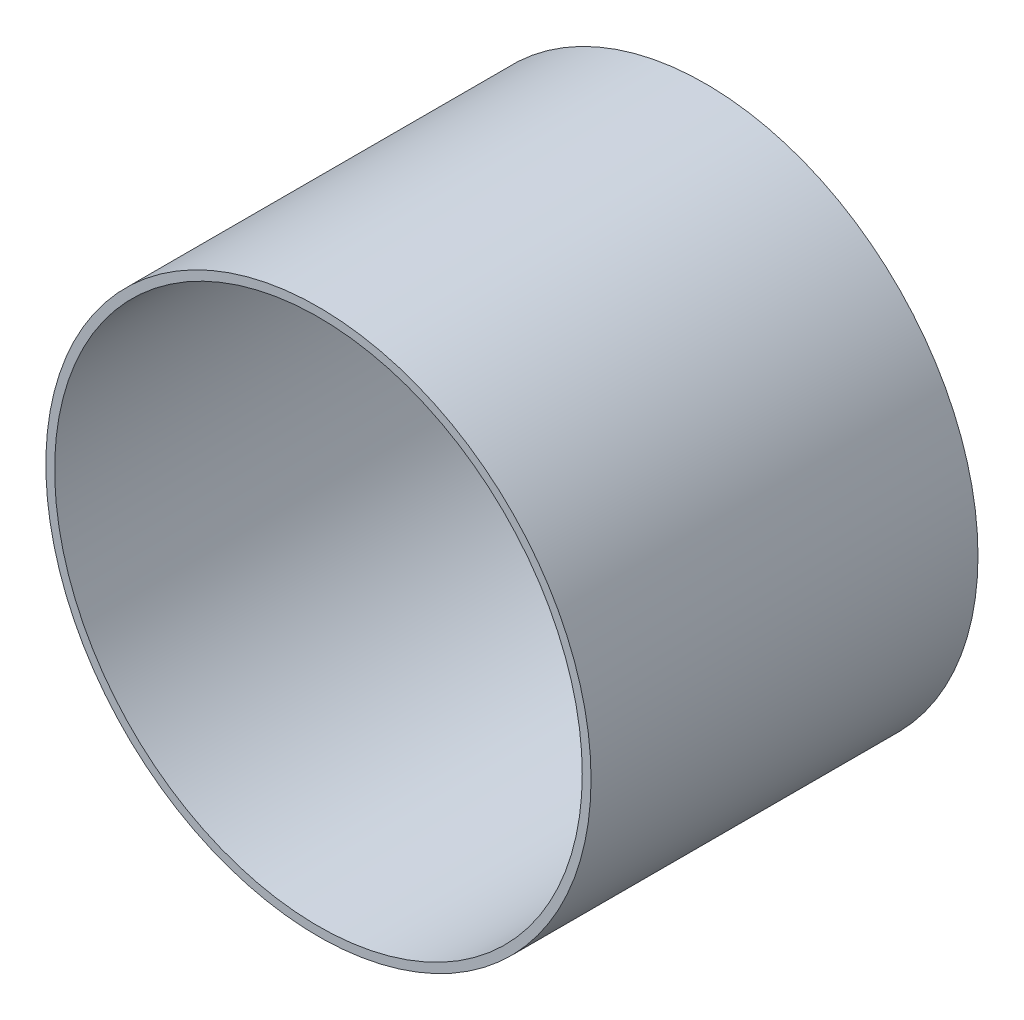
ISO-10303-21;
HEADER;
FILE_DESCRIPTION(('STEP AP214'),'2;1');
FILE_NAME('part.step','',(''),(''),'','','');
FILE_SCHEMA(('AUTOMOTIVE_DESIGN { 1 0 10303 214 1 1 1 1 }'));
ENDSEC;
DATA;
#1=APPLICATION_CONTEXT('core data for automotive mechanical design processes');
#2=APPLICATION_PROTOCOL_DEFINITION('international standard','automotive_design',2000,#1);
#3=PRODUCT_CONTEXT('',#1,'mechanical');
#4=PRODUCT('Part','Part','',(#3));
#5=PRODUCT_RELATED_PRODUCT_CATEGORY('part','',(#4));
#6=PRODUCT_DEFINITION_FORMATION('','',#4);
#7=PRODUCT_DEFINITION_CONTEXT('part definition',#1,'design');
#8=PRODUCT_DEFINITION('design','',#6,#7);
#9=PRODUCT_DEFINITION_SHAPE('','',#8);
#10=(LENGTH_UNIT() NAMED_UNIT(*) SI_UNIT(.MILLI.,.METRE.));
#11=(NAMED_UNIT(*) PLANE_ANGLE_UNIT() SI_UNIT($,.RADIAN.));
#12=(NAMED_UNIT(*) SI_UNIT($,.STERADIAN.) SOLID_ANGLE_UNIT());
#13=UNCERTAINTY_MEASURE_WITH_UNIT(LENGTH_MEASURE(1.E-05),#10,'distance_accuracy_value','');
#14=(GEOMETRIC_REPRESENTATION_CONTEXT(3) GLOBAL_UNCERTAINTY_ASSIGNED_CONTEXT((#13)) GLOBAL_UNIT_ASSIGNED_CONTEXT((#10,
#11,#12)) REPRESENTATION_CONTEXT('',''));
#15=CARTESIAN_POINT('',(0.,0.,0.));
#16=DIRECTION('',(0.,0.,1.));
#17=DIRECTION('',(1.,0.,0.));
#18=AXIS2_PLACEMENT_3D('',#15,#16,#17);
#19=CARTESIAN_POINT('',(0.,0.,22.));
#20=DIRECTION('',(0.,0.,1.));
#21=DIRECTION('',(1.,0.,0.));
#22=AXIS2_PLACEMENT_3D('',#19,#20,#21);
#23=PLANE('',#22);
#24=CARTESIAN_POINT('',(0.,0.,22.));
#25=DIRECTION('',(0.,0.,1.));
#26=DIRECTION('',(1.,0.,0.));
#27=AXIS2_PLACEMENT_3D('',#24,#25,#26);
#28=CIRCLE('',#27,15.5);
#29=CARTESIAN_POINT('',(15.5,0.,22.));
#30=VERTEX_POINT('',#29);
#31=EDGE_CURVE('E10',#30,#30,#28,.T.);
#32=ORIENTED_EDGE('',*,*,#31,.T.);
#33=EDGE_LOOP('',(#32));
#34=FACE_BOUND('',#33,.T.);
#35=CARTESIAN_POINT('',(0.,0.,22.));
#36=DIRECTION('',(0.,0.,1.));
#37=DIRECTION('',(1.,0.,0.));
#38=AXIS2_PLACEMENT_3D('',#35,#36,#37);
#39=CIRCLE('',#38,15.);
#40=CARTESIAN_POINT('',(15.,0.,22.));
#41=VERTEX_POINT('',#40);
#42=EDGE_CURVE('E50',#41,#41,#39,.T.);
#43=ORIENTED_EDGE('',*,*,#42,.F.);
#44=EDGE_LOOP('',(#43));
#45=FACE_BOUND('',#44,.T.);
#46=ADVANCED_FACE('F37',(#34,#45),#23,.T.);
#47=CARTESIAN_POINT('',(0.,0.,0.));
#48=DIRECTION('',(0.,0.,1.));
#49=DIRECTION('',(1.,0.,0.));
#50=AXIS2_PLACEMENT_3D('',#47,#48,#49);
#51=PLANE('',#50);
#52=CARTESIAN_POINT('',(0.,0.,0.));
#53=DIRECTION('',(0.,0.,1.));
#54=DIRECTION('',(1.,0.,0.));
#55=AXIS2_PLACEMENT_3D('',#52,#53,#54);
#56=CIRCLE('',#55,15.5);
#57=CARTESIAN_POINT('',(15.5,0.,0.));
#58=VERTEX_POINT('',#57);
#59=EDGE_CURVE('E41',#58,#58,#56,.T.);
#60=ORIENTED_EDGE('',*,*,#59,.F.);
#61=EDGE_LOOP('',(#60));
#62=FACE_BOUND('',#61,.T.);
#63=CARTESIAN_POINT('',(0.,0.,0.));
#64=DIRECTION('',(0.,0.,1.));
#65=DIRECTION('',(1.,0.,0.));
#66=AXIS2_PLACEMENT_3D('',#63,#64,#65);
#67=CIRCLE('',#66,15.);
#68=CARTESIAN_POINT('',(15.,0.,0.));
#69=VERTEX_POINT('',#68);
#70=EDGE_CURVE('E52',#69,#69,#67,.T.);
#71=ORIENTED_EDGE('',*,*,#70,.T.);
#72=EDGE_LOOP('',(#71));
#73=FACE_BOUND('',#72,.T.);
#74=ADVANCED_FACE('F64',(#62,#73),#51,.F.);
#75=CARTESIAN_POINT('',(0.,0.,22.));
#76=DIRECTION('',(0.,0.,-1.));
#77=DIRECTION('',(-1.,0.,0.));
#78=AXIS2_PLACEMENT_3D('',#75,#76,#77);
#79=CYLINDRICAL_SURFACE('',#78,15.5);
#80=ORIENTED_EDGE('',*,*,#31,.F.);
#81=EDGE_LOOP('',(#80));
#82=FACE_BOUND('',#81,.T.);
#83=ORIENTED_EDGE('',*,*,#59,.T.);
#84=EDGE_LOOP('',(#83));
#85=FACE_BOUND('',#84,.T.);
#86=ADVANCED_FACE('F39',(#82,#85),#79,.T.);
#87=CARTESIAN_POINT('',(0.,0.,22.));
#88=DIRECTION('',(0.,0.,-1.));
#89=DIRECTION('',(-1.,0.,0.));
#90=AXIS2_PLACEMENT_3D('',#87,#88,#89);
#91=CYLINDRICAL_SURFACE('',#90,15.);
#92=ORIENTED_EDGE('',*,*,#42,.T.);
#93=EDGE_LOOP('',(#92));
#94=FACE_BOUND('',#93,.T.);
#95=ORIENTED_EDGE('',*,*,#70,.F.);
#96=EDGE_LOOP('',(#95));
#97=FACE_BOUND('',#96,.T.);
#98=ADVANCED_FACE('F60',(#94,#97),#91,.F.);
#99=CLOSED_SHELL('',(#46,#74,#86,#98));
#100=MANIFOLD_SOLID_BREP('B2',#99);
#101=ADVANCED_BREP_SHAPE_REPRESENTATION('',(#18,#100),#14);
#102=SHAPE_DEFINITION_REPRESENTATION(#9,#101);
ENDSEC;
END-ISO-10303-21;
